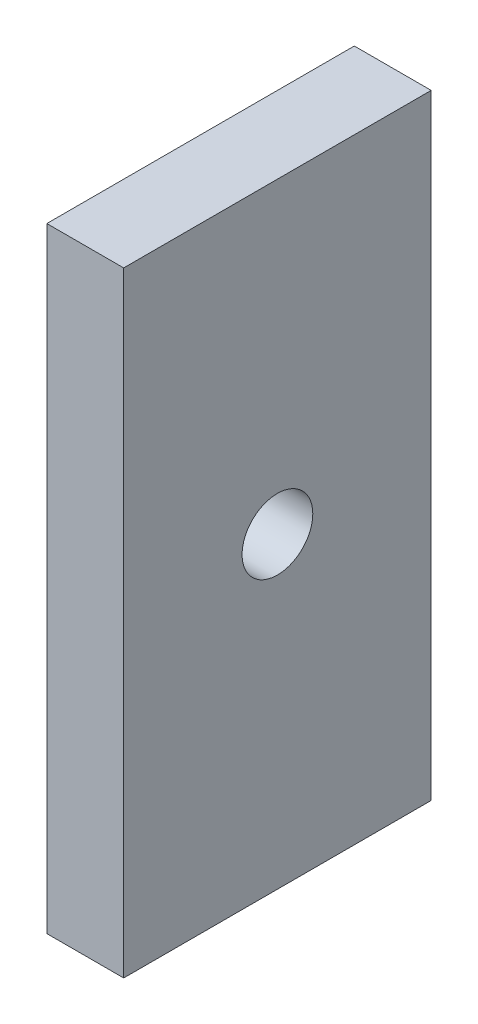
ISO-10303-21;
HEADER;
FILE_DESCRIPTION(('STEP AP214'),'2;1');
FILE_NAME('part.step','',(''),(''),'','','');
FILE_SCHEMA(('AUTOMOTIVE_DESIGN { 1 0 10303 214 1 1 1 1 }'));
ENDSEC;
DATA;
#1=APPLICATION_CONTEXT('core data for automotive mechanical design processes');
#2=APPLICATION_PROTOCOL_DEFINITION('international standard','automotive_design',2000,#1);
#3=PRODUCT_CONTEXT('',#1,'mechanical');
#4=PRODUCT('Part','Part','',(#3));
#5=PRODUCT_RELATED_PRODUCT_CATEGORY('part','',(#4));
#6=PRODUCT_DEFINITION_FORMATION('','',#4);
#7=PRODUCT_DEFINITION_CONTEXT('part definition',#1,'design');
#8=PRODUCT_DEFINITION('design','',#6,#7);
#9=PRODUCT_DEFINITION_SHAPE('','',#8);
#10=(LENGTH_UNIT() NAMED_UNIT(*) SI_UNIT(.MILLI.,.METRE.));
#11=(NAMED_UNIT(*) PLANE_ANGLE_UNIT() SI_UNIT($,.RADIAN.));
#12=(NAMED_UNIT(*) SI_UNIT($,.STERADIAN.) SOLID_ANGLE_UNIT());
#13=UNCERTAINTY_MEASURE_WITH_UNIT(LENGTH_MEASURE(1.E-05),#10,'distance_accuracy_value','');
#14=(GEOMETRIC_REPRESENTATION_CONTEXT(3) GLOBAL_UNCERTAINTY_ASSIGNED_CONTEXT((#13)) GLOBAL_UNIT_ASSIGNED_CONTEXT((#10,
#11,#12)) REPRESENTATION_CONTEXT('',''));
#15=CARTESIAN_POINT('',(0.,0.,0.));
#16=DIRECTION('',(0.,0.,1.));
#17=DIRECTION('',(1.,0.,0.));
#18=AXIS2_PLACEMENT_3D('',#15,#16,#17);
#19=CARTESIAN_POINT('',(3.175,0.,0.));
#20=DIRECTION('',(0.,0.,-1.));
#21=DIRECTION('',(-1.,0.,0.));
#22=AXIS2_PLACEMENT_3D('',#19,#20,#21);
#23=PLANE('',#22);
#24=DIRECTION('',(0.,-1.,0.));
#25=VECTOR('',#24,1.);
#26=CARTESIAN_POINT('',(0.,0.,0.));
#27=LINE('',#26,#25);
#28=CARTESIAN_POINT('',(0.,25.4,0.));
#29=VERTEX_POINT('',#28);
#30=CARTESIAN_POINT('',(0.,0.,0.));
#31=VERTEX_POINT('',#30);
#32=EDGE_CURVE('E105',#29,#31,#27,.T.);
#33=ORIENTED_EDGE('',*,*,#32,.T.);
#34=DIRECTION('',(-1.,0.,0.));
#35=VECTOR('',#34,1.);
#36=CARTESIAN_POINT('',(3.175,0.,0.));
#37=LINE('',#36,#35);
#38=CARTESIAN_POINT('',(3.175,0.,0.));
#39=VERTEX_POINT('',#38);
#40=EDGE_CURVE('E11',#39,#31,#37,.T.);
#41=ORIENTED_EDGE('',*,*,#40,.F.);
#42=DIRECTION('',(0.,-1.,0.));
#43=VECTOR('',#42,1.);
#44=CARTESIAN_POINT('',(3.175,0.,0.));
#45=LINE('',#44,#43);
#46=CARTESIAN_POINT('',(3.175,25.4,0.));
#47=VERTEX_POINT('',#46);
#48=EDGE_CURVE('E89',#47,#39,#45,.T.);
#49=ORIENTED_EDGE('',*,*,#48,.F.);
#50=DIRECTION('',(-1.,0.,0.));
#51=VECTOR('',#50,1.);
#52=CARTESIAN_POINT('',(3.175,25.4,0.));
#53=LINE('',#52,#51);
#54=EDGE_CURVE('E98',#47,#29,#53,.T.);
#55=ORIENTED_EDGE('',*,*,#54,.T.);
#56=EDGE_LOOP('',(#33,#41,#49,#55));
#57=FACE_BOUND('',#56,.T.);
#58=ADVANCED_FACE('F39',(#57),#23,.F.);
#59=CARTESIAN_POINT('',(3.175,0.,0.));
#60=DIRECTION('',(0.,1.,0.));
#61=DIRECTION('',(0.,0.,1.));
#62=AXIS2_PLACEMENT_3D('',#59,#60,#61);
#63=PLANE('',#62);
#64=DIRECTION('',(0.,0.,-1.));
#65=VECTOR('',#64,1.);
#66=CARTESIAN_POINT('',(0.,0.,0.));
#67=LINE('',#66,#65);
#68=CARTESIAN_POINT('',(0.,0.,-12.7));
#69=VERTEX_POINT('',#68);
#70=EDGE_CURVE('E94',#31,#69,#67,.T.);
#71=ORIENTED_EDGE('',*,*,#70,.T.);
#72=DIRECTION('',(-1.,0.,0.));
#73=VECTOR('',#72,1.);
#74=CARTESIAN_POINT('',(3.175,0.,-12.7));
#75=LINE('',#74,#73);
#76=CARTESIAN_POINT('',(3.175,0.,-12.7));
#77=VERTEX_POINT('',#76);
#78=EDGE_CURVE('E50',#77,#69,#75,.T.);
#79=ORIENTED_EDGE('',*,*,#78,.F.);
#80=DIRECTION('',(0.,0.,-1.));
#81=VECTOR('',#80,1.);
#82=CARTESIAN_POINT('',(3.175,0.,0.));
#83=LINE('',#82,#81);
#84=EDGE_CURVE('E85',#39,#77,#83,.T.);
#85=ORIENTED_EDGE('',*,*,#84,.F.);
#86=ORIENTED_EDGE('',*,*,#40,.T.);
#87=EDGE_LOOP('',(#71,#79,#85,#86));
#88=FACE_BOUND('',#87,.T.);
#89=ADVANCED_FACE('F91',(#88),#63,.F.);
#90=CARTESIAN_POINT('',(3.175,0.,-12.7));
#91=DIRECTION('',(0.,0.,1.));
#92=DIRECTION('',(1.,0.,0.));
#93=AXIS2_PLACEMENT_3D('',#90,#91,#92);
#94=PLANE('',#93);
#95=DIRECTION('',(0.,1.,0.));
#96=VECTOR('',#95,1.);
#97=CARTESIAN_POINT('',(0.,0.,-12.7));
#98=LINE('',#97,#96);
#99=CARTESIAN_POINT('',(0.,25.4,-12.7));
#100=VERTEX_POINT('',#99);
#101=EDGE_CURVE('E75',#69,#100,#98,.T.);
#102=ORIENTED_EDGE('',*,*,#101,.T.);
#103=DIRECTION('',(-1.,0.,0.));
#104=VECTOR('',#103,1.);
#105=CARTESIAN_POINT('',(3.175,25.4,-12.7));
#106=LINE('',#105,#104);
#107=CARTESIAN_POINT('',(3.175,25.4,-12.7));
#108=VERTEX_POINT('',#107);
#109=EDGE_CURVE('E92',#108,#100,#106,.T.);
#110=ORIENTED_EDGE('',*,*,#109,.F.);
#111=DIRECTION('',(0.,1.,0.));
#112=VECTOR('',#111,1.);
#113=CARTESIAN_POINT('',(3.175,0.,-12.7));
#114=LINE('',#113,#112);
#115=EDGE_CURVE('E86',#77,#108,#114,.T.);
#116=ORIENTED_EDGE('',*,*,#115,.F.);
#117=ORIENTED_EDGE('',*,*,#78,.T.);
#118=EDGE_LOOP('',(#102,#110,#116,#117));
#119=FACE_BOUND('',#118,.T.);
#120=ADVANCED_FACE('F96',(#119),#94,.F.);
#121=CARTESIAN_POINT('',(3.175,25.4,0.));
#122=DIRECTION('',(0.,-1.,0.));
#123=DIRECTION('',(0.,0.,-1.));
#124=AXIS2_PLACEMENT_3D('',#121,#122,#123);
#125=PLANE('',#124);
#126=DIRECTION('',(0.,0.,1.));
#127=VECTOR('',#126,1.);
#128=CARTESIAN_POINT('',(0.,25.4,0.));
#129=LINE('',#128,#127);
#130=EDGE_CURVE('E79',#100,#29,#129,.T.);
#131=ORIENTED_EDGE('',*,*,#130,.T.);
#132=ORIENTED_EDGE('',*,*,#54,.F.);
#133=DIRECTION('',(0.,0.,1.));
#134=VECTOR('',#133,1.);
#135=CARTESIAN_POINT('',(3.175,25.4,0.));
#136=LINE('',#135,#134);
#137=EDGE_CURVE('E54',#108,#47,#136,.T.);
#138=ORIENTED_EDGE('',*,*,#137,.F.);
#139=ORIENTED_EDGE('',*,*,#109,.T.);
#140=EDGE_LOOP('',(#131,#132,#138,#139));
#141=FACE_BOUND('',#140,.T.);
#142=ADVANCED_FACE('F109',(#141),#125,.F.);
#143=CARTESIAN_POINT('',(3.175,0.,0.));
#144=DIRECTION('',(-1.,0.,0.));
#145=DIRECTION('',(0.,0.,1.));
#146=AXIS2_PLACEMENT_3D('',#143,#144,#145);
#147=PLANE('',#146);
#148=CARTESIAN_POINT('',(3.175,12.7,-6.35));
#149=DIRECTION('',(1.,0.,0.));
#150=DIRECTION('',(0.,0.,-1.));
#151=AXIS2_PLACEMENT_3D('',#148,#149,#150);
#152=CIRCLE('',#151,1.4605);
#153=CARTESIAN_POINT('',(3.175,12.7,-7.8105));
#154=VERTEX_POINT('',#153);
#155=EDGE_CURVE('E117',#154,#154,#152,.T.);
#156=ORIENTED_EDGE('',*,*,#155,.F.);
#157=EDGE_LOOP('',(#156));
#158=FACE_BOUND('',#157,.T.);
#159=ORIENTED_EDGE('',*,*,#48,.T.);
#160=ORIENTED_EDGE('',*,*,#84,.T.);
#161=ORIENTED_EDGE('',*,*,#115,.T.);
#162=ORIENTED_EDGE('',*,*,#137,.T.);
#163=EDGE_LOOP('',(#159,#160,#161,#162));
#164=FACE_BOUND('',#163,.T.);
#165=ADVANCED_FACE('F88',(#158,#164),#147,.F.);
#166=CARTESIAN_POINT('',(0.,0.,0.));
#167=DIRECTION('',(-1.,0.,0.));
#168=DIRECTION('',(0.,0.,1.));
#169=AXIS2_PLACEMENT_3D('',#166,#167,#168);
#170=PLANE('',#169);
#171=CARTESIAN_POINT('',(0.,12.7,-6.35));
#172=DIRECTION('',(1.,0.,0.));
#173=DIRECTION('',(0.,0.,-1.));
#174=AXIS2_PLACEMENT_3D('',#171,#172,#173);
#175=CIRCLE('',#174,1.4605);
#176=CARTESIAN_POINT('',(0.,12.7,-7.8105));
#177=VERTEX_POINT('',#176);
#178=EDGE_CURVE('E104',#177,#177,#175,.T.);
#179=ORIENTED_EDGE('',*,*,#178,.T.);
#180=EDGE_LOOP('',(#179));
#181=FACE_BOUND('',#180,.T.);
#182=ORIENTED_EDGE('',*,*,#32,.F.);
#183=ORIENTED_EDGE('',*,*,#130,.F.);
#184=ORIENTED_EDGE('',*,*,#101,.F.);
#185=ORIENTED_EDGE('',*,*,#70,.F.);
#186=EDGE_LOOP('',(#182,#183,#184,#185));
#187=FACE_BOUND('',#186,.T.);
#188=ADVANCED_FACE('F114',(#181,#187),#170,.T.);
#189=CARTESIAN_POINT('',(0.,12.7,-6.35));
#190=DIRECTION('',(1.,0.,0.));
#191=DIRECTION('',(0.,0.,-1.));
#192=AXIS2_PLACEMENT_3D('',#189,#190,#191);
#193=CYLINDRICAL_SURFACE('',#192,1.4605);
#194=ORIENTED_EDGE('',*,*,#178,.F.);
#195=EDGE_LOOP('',(#194));
#196=FACE_BOUND('',#195,.T.);
#197=ORIENTED_EDGE('',*,*,#155,.T.);
#198=EDGE_LOOP('',(#197));
#199=FACE_BOUND('',#198,.T.);
#200=ADVANCED_FACE('F124',(#196,#199),#193,.F.);
#201=CLOSED_SHELL('',(#58,#89,#120,#142,#165,#188,#200));
#202=MANIFOLD_SOLID_BREP('B2',#201);
#203=ADVANCED_BREP_SHAPE_REPRESENTATION('',(#18,#202),#14);
#204=SHAPE_DEFINITION_REPRESENTATION(#9,#203);
ENDSEC;
END-ISO-10303-21;
